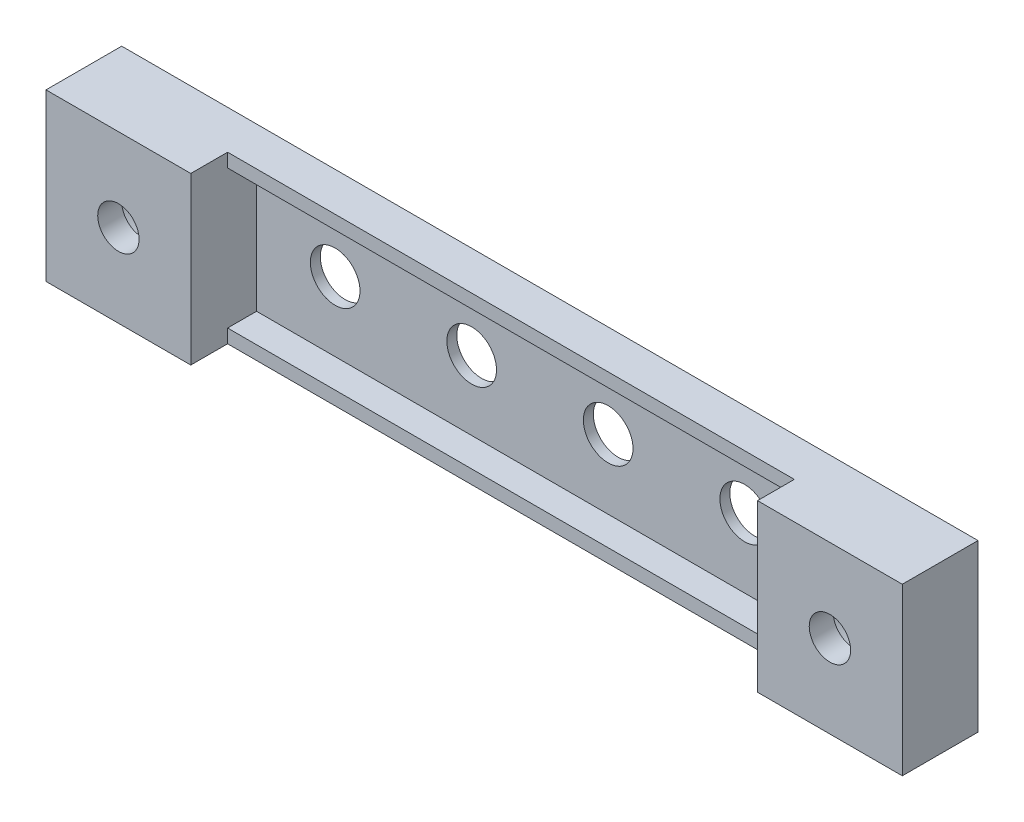
ISO-10303-21;
HEADER;
FILE_DESCRIPTION(('STEP AP214'),'2;1');
FILE_NAME('part.step','',(''),(''),'','','');
FILE_SCHEMA(('AUTOMOTIVE_DESIGN { 1 0 10303 214 1 1 1 1 }'));
ENDSEC;
DATA;
#1=APPLICATION_CONTEXT('core data for automotive mechanical design processes');
#2=APPLICATION_PROTOCOL_DEFINITION('international standard','automotive_design',2000,#1);
#3=PRODUCT_CONTEXT('',#1,'mechanical');
#4=PRODUCT('Part','Part','',(#3));
#5=PRODUCT_RELATED_PRODUCT_CATEGORY('part','',(#4));
#6=PRODUCT_DEFINITION_FORMATION('','',#4);
#7=PRODUCT_DEFINITION_CONTEXT('part definition',#1,'design');
#8=PRODUCT_DEFINITION('design','',#6,#7);
#9=PRODUCT_DEFINITION_SHAPE('','',#8);
#10=(LENGTH_UNIT() NAMED_UNIT(*) SI_UNIT(.MILLI.,.METRE.));
#11=(NAMED_UNIT(*) PLANE_ANGLE_UNIT() SI_UNIT($,.RADIAN.));
#12=(NAMED_UNIT(*) SI_UNIT($,.STERADIAN.) SOLID_ANGLE_UNIT());
#13=UNCERTAINTY_MEASURE_WITH_UNIT(LENGTH_MEASURE(1.E-05),#10,'distance_accuracy_value','');
#14=(GEOMETRIC_REPRESENTATION_CONTEXT(3) GLOBAL_UNCERTAINTY_ASSIGNED_CONTEXT((#13)) GLOBAL_UNIT_ASSIGNED_CONTEXT((#10,
#11,#12)) REPRESENTATION_CONTEXT('',''));
#15=CARTESIAN_POINT('',(0.,0.,0.));
#16=DIRECTION('',(0.,0.,1.));
#17=DIRECTION('',(1.,0.,0.));
#18=AXIS2_PLACEMENT_3D('',#15,#16,#17);
#19=CARTESIAN_POINT('',(-16.7,7.69215932263775,1.4));
#20=DIRECTION('',(0.,-1.,0.));
#21=DIRECTION('',(0.,0.,-1.));
#22=AXIS2_PLACEMENT_3D('',#19,#20,#21);
#23=PLANE('',#22);
#24=DIRECTION('',(1.,0.,0.));
#25=VECTOR('',#24,1.);
#26=CARTESIAN_POINT('',(-16.7,7.69215932263775,-0.48));
#27=LINE('',#26,#25);
#28=CARTESIAN_POINT('',(-20.7,7.69215932263775,-0.48));
#29=VERTEX_POINT('',#28);
#30=CARTESIAN_POINT('',(20.7,7.69215932263775,-0.48));
#31=VERTEX_POINT('',#30);
#32=EDGE_CURVE('E127',#29,#31,#27,.T.);
#33=ORIENTED_EDGE('',*,*,#32,.F.);
#34=DIRECTION('',(0.,0.,-1.));
#35=VECTOR('',#34,1.);
#36=CARTESIAN_POINT('',(-20.7,7.69215932263775,-0.48));
#37=LINE('',#36,#35);
#38=CARTESIAN_POINT('',(-20.7,7.69215932263775,3.18));
#39=VERTEX_POINT('',#38);
#40=EDGE_CURVE('E139',#39,#29,#37,.T.);
#41=ORIENTED_EDGE('',*,*,#40,.F.);
#42=DIRECTION('',(-1.,0.,0.));
#43=VECTOR('',#42,1.);
#44=CARTESIAN_POINT('',(-16.7,7.69215932263775,3.18));
#45=LINE('',#44,#43);
#46=CARTESIAN_POINT('',(-13.7,7.69215932263775,3.18));
#47=VERTEX_POINT('',#46);
#48=EDGE_CURVE('E221',#47,#39,#45,.T.);
#49=ORIENTED_EDGE('',*,*,#48,.F.);
#50=DIRECTION('',(0.,0.,-1.));
#51=VECTOR('',#50,1.);
#52=CARTESIAN_POINT('',(-13.7,7.69215932263775,3.18));
#53=LINE('',#52,#51);
#54=CARTESIAN_POINT('',(-13.7,7.69215932263775,1.4));
#55=VERTEX_POINT('',#54);
#56=EDGE_CURVE('E222',#47,#55,#53,.T.);
#57=ORIENTED_EDGE('',*,*,#56,.T.);
#58=DIRECTION('',(-1.,0.,0.));
#59=VECTOR('',#58,1.);
#60=CARTESIAN_POINT('',(-16.7,7.69215932263775,1.4));
#61=LINE('',#60,#59);
#62=CARTESIAN_POINT('',(13.7,7.69215932263775,1.4));
#63=VERTEX_POINT('',#62);
#64=EDGE_CURVE('E256',#63,#55,#61,.T.);
#65=ORIENTED_EDGE('',*,*,#64,.F.);
#66=DIRECTION('',(0.,0.,-1.));
#67=VECTOR('',#66,1.);
#68=CARTESIAN_POINT('',(13.7,7.69215932263775,3.18));
#69=LINE('',#68,#67);
#70=CARTESIAN_POINT('',(13.7,7.69215932263775,3.18));
#71=VERTEX_POINT('',#70);
#72=EDGE_CURVE('E215',#71,#63,#69,.T.);
#73=ORIENTED_EDGE('',*,*,#72,.F.);
#74=DIRECTION('',(-1.,0.,0.));
#75=VECTOR('',#74,1.);
#76=CARTESIAN_POINT('',(16.7,7.69215932263775,3.18));
#77=LINE('',#76,#75);
#78=CARTESIAN_POINT('',(20.7,7.69215932263775,3.18));
#79=VERTEX_POINT('',#78);
#80=EDGE_CURVE('E144',#79,#71,#77,.T.);
#81=ORIENTED_EDGE('',*,*,#80,.F.);
#82=DIRECTION('',(0.,0.,1.));
#83=VECTOR('',#82,1.);
#84=CARTESIAN_POINT('',(20.7,7.69215932263775,-0.48));
#85=LINE('',#84,#83);
#86=EDGE_CURVE('E142',#31,#79,#85,.T.);
#87=ORIENTED_EDGE('',*,*,#86,.F.);
#88=EDGE_LOOP('',(#33,#41,#49,#57,#65,#73,#81,#87));
#89=FACE_BOUND('',#88,.T.);
#90=ADVANCED_FACE('F35',(#89),#23,.F.);
#91=CARTESIAN_POINT('',(-16.7,-0.330719774212582,1.4));
#92=DIRECTION('',(0.,1.,0.));
#93=DIRECTION('',(0.,0.,1.));
#94=AXIS2_PLACEMENT_3D('',#91,#92,#93);
#95=PLANE('',#94);
#96=DIRECTION('',(-1.,0.,0.));
#97=VECTOR('',#96,1.);
#98=CARTESIAN_POINT('',(-16.7,-0.330719774212582,-0.48));
#99=LINE('',#98,#97);
#100=CARTESIAN_POINT('',(20.7,-0.330719774212582,-0.48));
#101=VERTEX_POINT('',#100);
#102=CARTESIAN_POINT('',(-20.7,-0.330719774212582,-0.48));
#103=VERTEX_POINT('',#102);
#104=EDGE_CURVE('E138',#101,#103,#99,.T.);
#105=ORIENTED_EDGE('',*,*,#104,.F.);
#106=DIRECTION('',(0.,0.,-1.));
#107=VECTOR('',#106,1.);
#108=CARTESIAN_POINT('',(20.7,-0.330719774212582,-0.48));
#109=LINE('',#108,#107);
#110=CARTESIAN_POINT('',(20.7,-0.330719774212582,3.18));
#111=VERTEX_POINT('',#110);
#112=EDGE_CURVE('E153',#111,#101,#109,.T.);
#113=ORIENTED_EDGE('',*,*,#112,.F.);
#114=DIRECTION('',(1.,0.,0.));
#115=VECTOR('',#114,1.);
#116=CARTESIAN_POINT('',(16.7,-0.330719774212582,3.18));
#117=LINE('',#116,#115);
#118=CARTESIAN_POINT('',(13.7,-0.330719774212582,3.18));
#119=VERTEX_POINT('',#118);
#120=EDGE_CURVE('E209',#119,#111,#117,.T.);
#121=ORIENTED_EDGE('',*,*,#120,.F.);
#122=DIRECTION('',(0.,0.,-1.));
#123=VECTOR('',#122,1.);
#124=CARTESIAN_POINT('',(13.7,-0.330719774212582,3.18));
#125=LINE('',#124,#123);
#126=CARTESIAN_POINT('',(13.7,-0.330719774212582,1.4));
#127=VERTEX_POINT('',#126);
#128=EDGE_CURVE('E211',#119,#127,#125,.T.);
#129=ORIENTED_EDGE('',*,*,#128,.T.);
#130=DIRECTION('',(1.,0.,0.));
#131=VECTOR('',#130,1.);
#132=CARTESIAN_POINT('',(-16.7,-0.330719774212582,1.4));
#133=LINE('',#132,#131);
#134=CARTESIAN_POINT('',(-13.7,-0.330719774212582,1.4));
#135=VERTEX_POINT('',#134);
#136=EDGE_CURVE('E43',#135,#127,#133,.T.);
#137=ORIENTED_EDGE('',*,*,#136,.F.);
#138=DIRECTION('',(0.,0.,-1.));
#139=VECTOR('',#138,1.);
#140=CARTESIAN_POINT('',(-13.7,-0.330719774212582,3.18));
#141=LINE('',#140,#139);
#142=CARTESIAN_POINT('',(-13.7,-0.330719774212582,3.18));
#143=VERTEX_POINT('',#142);
#144=EDGE_CURVE('E226',#143,#135,#141,.T.);
#145=ORIENTED_EDGE('',*,*,#144,.F.);
#146=DIRECTION('',(1.,0.,0.));
#147=VECTOR('',#146,1.);
#148=CARTESIAN_POINT('',(-16.7,-0.330719774212582,3.18));
#149=LINE('',#148,#147);
#150=CARTESIAN_POINT('',(-20.7,-0.330719774212582,3.18));
#151=VERTEX_POINT('',#150);
#152=EDGE_CURVE('E217',#151,#143,#149,.T.);
#153=ORIENTED_EDGE('',*,*,#152,.F.);
#154=DIRECTION('',(0.,0.,1.));
#155=VECTOR('',#154,1.);
#156=CARTESIAN_POINT('',(-20.7,-0.330719774212582,-0.48));
#157=LINE('',#156,#155);
#158=EDGE_CURVE('E176',#103,#151,#157,.T.);
#159=ORIENTED_EDGE('',*,*,#158,.F.);
#160=EDGE_LOOP('',(#105,#113,#121,#129,#137,#145,#153,#159));
#161=FACE_BOUND('',#160,.T.);
#162=ADVANCED_FACE('F260',(#161),#95,.F.);
#163=CARTESIAN_POINT('',(9.9,3.68071977421258,0.42));
#164=DIRECTION('',(0.,0.,-1.));
#165=DIRECTION('',(-1.,0.,0.));
#166=AXIS2_PLACEMENT_3D('',#163,#164,#165);
#167=CYLINDRICAL_SURFACE('',#166,1.2);
#168=CARTESIAN_POINT('',(9.9,3.68071977421258,0.));
#169=DIRECTION('',(0.,0.,1.));
#170=DIRECTION('',(1.,0.,0.));
#171=AXIS2_PLACEMENT_3D('',#168,#169,#170);
#172=CIRCLE('',#171,1.2);
#173=CARTESIAN_POINT('',(11.1,3.68071977421258,0.));
#174=VERTEX_POINT('',#173);
#175=EDGE_CURVE('E202',#174,#174,#172,.T.);
#176=ORIENTED_EDGE('',*,*,#175,.T.);
#177=EDGE_LOOP('',(#176));
#178=FACE_BOUND('',#177,.T.);
#179=CARTESIAN_POINT('',(9.9,3.68071977421258,-0.48));
#180=DIRECTION('',(0.,0.,-1.));
#181=DIRECTION('',(-1.,0.,0.));
#182=AXIS2_PLACEMENT_3D('',#179,#180,#181);
#183=CIRCLE('',#182,1.2);
#184=CARTESIAN_POINT('',(8.7,3.68071977421258,-0.48));
#185=VERTEX_POINT('',#184);
#186=EDGE_CURVE('E190',#185,#185,#183,.F.);
#187=ORIENTED_EDGE('',*,*,#186,.F.);
#188=EDGE_LOOP('',(#187));
#189=FACE_BOUND('',#188,.T.);
#190=ADVANCED_FACE('F303',(#178,#189),#167,.F.);
#191=CARTESIAN_POINT('',(-9.9,3.68071977421258,0.42));
#192=DIRECTION('',(0.,0.,-1.));
#193=DIRECTION('',(-1.,0.,0.));
#194=AXIS2_PLACEMENT_3D('',#191,#192,#193);
#195=CYLINDRICAL_SURFACE('',#194,1.2);
#196=CARTESIAN_POINT('',(-9.9,3.68071977421258,0.));
#197=DIRECTION('',(0.,0.,1.));
#198=DIRECTION('',(1.,0.,0.));
#199=AXIS2_PLACEMENT_3D('',#196,#197,#198);
#200=CIRCLE('',#199,1.2);
#201=CARTESIAN_POINT('',(-8.7,3.68071977421258,0.));
#202=VERTEX_POINT('',#201);
#203=EDGE_CURVE('E193',#202,#202,#200,.T.);
#204=ORIENTED_EDGE('',*,*,#203,.T.);
#205=EDGE_LOOP('',(#204));
#206=FACE_BOUND('',#205,.T.);
#207=CARTESIAN_POINT('',(-9.9,3.68071977421258,-0.48));
#208=DIRECTION('',(0.,0.,-1.));
#209=DIRECTION('',(-1.,0.,0.));
#210=AXIS2_PLACEMENT_3D('',#207,#208,#209);
#211=CIRCLE('',#210,1.2);
#212=CARTESIAN_POINT('',(-11.1,3.68071977421258,-0.48));
#213=VERTEX_POINT('',#212);
#214=EDGE_CURVE('E187',#213,#213,#211,.F.);
#215=ORIENTED_EDGE('',*,*,#214,.F.);
#216=EDGE_LOOP('',(#215));
#217=FACE_BOUND('',#216,.T.);
#218=ADVANCED_FACE('F307',(#206,#217),#195,.F.);
#219=CARTESIAN_POINT('',(-3.3,3.68071977421258,0.42));
#220=DIRECTION('',(0.,0.,-1.));
#221=DIRECTION('',(-1.,0.,0.));
#222=AXIS2_PLACEMENT_3D('',#219,#220,#221);
#223=CYLINDRICAL_SURFACE('',#222,1.2);
#224=CARTESIAN_POINT('',(-3.3,3.68071977421258,0.));
#225=DIRECTION('',(0.,0.,1.));
#226=DIRECTION('',(1.,0.,0.));
#227=AXIS2_PLACEMENT_3D('',#224,#225,#226);
#228=CIRCLE('',#227,1.2);
#229=CARTESIAN_POINT('',(-2.1,3.68071977421258,0.));
#230=VERTEX_POINT('',#229);
#231=EDGE_CURVE('E196',#230,#230,#228,.T.);
#232=ORIENTED_EDGE('',*,*,#231,.T.);
#233=EDGE_LOOP('',(#232));
#234=FACE_BOUND('',#233,.T.);
#235=CARTESIAN_POINT('',(-3.3,3.68071977421258,-0.48));
#236=DIRECTION('',(0.,0.,-1.));
#237=DIRECTION('',(-1.,0.,0.));
#238=AXIS2_PLACEMENT_3D('',#235,#236,#237);
#239=CIRCLE('',#238,1.2);
#240=CARTESIAN_POINT('',(-4.5,3.68071977421258,-0.48));
#241=VERTEX_POINT('',#240);
#242=EDGE_CURVE('E184',#241,#241,#239,.F.);
#243=ORIENTED_EDGE('',*,*,#242,.F.);
#244=EDGE_LOOP('',(#243));
#245=FACE_BOUND('',#244,.T.);
#246=ADVANCED_FACE('F317',(#234,#245),#223,.F.);
#247=CARTESIAN_POINT('',(3.3,3.68071977421258,0.42));
#248=DIRECTION('',(0.,0.,-1.));
#249=DIRECTION('',(-1.,0.,0.));
#250=AXIS2_PLACEMENT_3D('',#247,#248,#249);
#251=CYLINDRICAL_SURFACE('',#250,1.2);
#252=CARTESIAN_POINT('',(3.3,3.68071977421258,0.));
#253=DIRECTION('',(0.,0.,1.));
#254=DIRECTION('',(1.,0.,0.));
#255=AXIS2_PLACEMENT_3D('',#252,#253,#254);
#256=CIRCLE('',#255,1.2);
#257=CARTESIAN_POINT('',(4.5,3.68071977421258,0.));
#258=VERTEX_POINT('',#257);
#259=EDGE_CURVE('E199',#258,#258,#256,.T.);
#260=ORIENTED_EDGE('',*,*,#259,.T.);
#261=EDGE_LOOP('',(#260));
#262=FACE_BOUND('',#261,.T.);
#263=CARTESIAN_POINT('',(3.3,3.68071977421258,-0.48));
#264=DIRECTION('',(0.,0.,-1.));
#265=DIRECTION('',(-1.,0.,0.));
#266=AXIS2_PLACEMENT_3D('',#263,#264,#265);
#267=CIRCLE('',#266,1.2);
#268=CARTESIAN_POINT('',(2.1,3.68071977421258,-0.48));
#269=VERTEX_POINT('',#268);
#270=EDGE_CURVE('E38',#269,#269,#267,.F.);
#271=ORIENTED_EDGE('',*,*,#270,.F.);
#272=EDGE_LOOP('',(#271));
#273=FACE_BOUND('',#272,.T.);
#274=ADVANCED_FACE('F312',(#262,#273),#251,.F.);
#275=CARTESIAN_POINT('',(0.,0.,1.4));
#276=DIRECTION('',(0.,0.,1.));
#277=DIRECTION('',(1.,0.,0.));
#278=AXIS2_PLACEMENT_3D('',#275,#276,#277);
#279=PLANE('',#278);
#280=ORIENTED_EDGE('',*,*,#136,.T.);
#281=DIRECTION('',(0.,-1.,0.));
#282=VECTOR('',#281,1.);
#283=CARTESIAN_POINT('',(13.7,7.69215932263775,1.4));
#284=LINE('',#283,#282);
#285=CARTESIAN_POINT('',(13.7,0.330719774212581,1.4));
#286=VERTEX_POINT('',#285);
#287=EDGE_CURVE('E205',#286,#127,#284,.T.);
#288=ORIENTED_EDGE('',*,*,#287,.F.);
#289=DIRECTION('',(1.,0.,0.));
#290=VECTOR('',#289,1.);
#291=CARTESIAN_POINT('',(-13.7,0.330719774212582,1.4));
#292=LINE('',#291,#290);
#293=CARTESIAN_POINT('',(-13.7,0.330719774212582,1.4));
#294=VERTEX_POINT('',#293);
#295=EDGE_CURVE('E230',#294,#286,#292,.T.);
#296=ORIENTED_EDGE('',*,*,#295,.F.);
#297=DIRECTION('',(0.,1.,0.));
#298=VECTOR('',#297,1.);
#299=CARTESIAN_POINT('',(-13.7,7.69215932263775,1.4));
#300=LINE('',#299,#298);
#301=EDGE_CURVE('E45',#135,#294,#300,.T.);
#302=ORIENTED_EDGE('',*,*,#301,.F.);
#303=EDGE_LOOP('',(#280,#288,#296,#302));
#304=FACE_BOUND('',#303,.T.);
#305=ADVANCED_FACE('F257',(#304),#279,.T.);
#306=DIRECTION('',(-1.,0.,0.));
#307=VECTOR('',#306,1.);
#308=CARTESIAN_POINT('',(-13.7,7.03071977421258,1.4));
#309=LINE('',#308,#307);
#310=CARTESIAN_POINT('',(13.7,7.03071977421258,1.4));
#311=VERTEX_POINT('',#310);
#312=CARTESIAN_POINT('',(-13.7,7.03071977421258,1.4));
#313=VERTEX_POINT('',#312);
#314=EDGE_CURVE('E233',#311,#313,#309,.T.);
#315=ORIENTED_EDGE('',*,*,#314,.F.);
#316=EDGE_CURVE('E59',#63,#311,#284,.T.);
#317=ORIENTED_EDGE('',*,*,#316,.F.);
#318=ORIENTED_EDGE('',*,*,#64,.T.);
#319=EDGE_CURVE('E11',#313,#55,#300,.T.);
#320=ORIENTED_EDGE('',*,*,#319,.F.);
#321=EDGE_LOOP('',(#315,#317,#318,#320));
#322=FACE_BOUND('',#321,.T.);
#323=ADVANCED_FACE('F279',(#322),#279,.T.);
#324=CARTESIAN_POINT('',(-13.7,7.03071977421258,1.4));
#325=DIRECTION('',(1.,0.,0.));
#326=DIRECTION('',(0.,1.,0.));
#327=AXIS2_PLACEMENT_3D('',#324,#325,#326);
#328=PLANE('',#327);
#329=DIRECTION('',(0.,-1.,0.));
#330=VECTOR('',#329,1.);
#331=CARTESIAN_POINT('',(-13.7,7.03071977421258,0.));
#332=LINE('',#331,#330);
#333=CARTESIAN_POINT('',(-13.7,7.03071977421258,0.));
#334=VERTEX_POINT('',#333);
#335=CARTESIAN_POINT('',(-13.7,0.330719774212582,0.));
#336=VERTEX_POINT('',#335);
#337=EDGE_CURVE('E229',#334,#336,#332,.T.);
#338=ORIENTED_EDGE('',*,*,#337,.F.);
#339=DIRECTION('',(0.,0.,-1.));
#340=VECTOR('',#339,1.);
#341=CARTESIAN_POINT('',(-13.7,7.03071977421258,1.4));
#342=LINE('',#341,#340);
#343=EDGE_CURVE('E237',#313,#334,#342,.T.);
#344=ORIENTED_EDGE('',*,*,#343,.F.);
#345=ORIENTED_EDGE('',*,*,#319,.T.);
#346=ORIENTED_EDGE('',*,*,#56,.F.);
#347=DIRECTION('',(0.,1.,0.));
#348=VECTOR('',#347,1.);
#349=CARTESIAN_POINT('',(-13.7,7.69215932263775,3.18));
#350=LINE('',#349,#348);
#351=EDGE_CURVE('E219',#143,#47,#350,.T.);
#352=ORIENTED_EDGE('',*,*,#351,.F.);
#353=ORIENTED_EDGE('',*,*,#144,.T.);
#354=ORIENTED_EDGE('',*,*,#301,.T.);
#355=DIRECTION('',(0.,0.,-1.));
#356=VECTOR('',#355,1.);
#357=CARTESIAN_POINT('',(-13.7,0.330719774212582,1.4));
#358=LINE('',#357,#356);
#359=EDGE_CURVE('E253',#294,#336,#358,.T.);
#360=ORIENTED_EDGE('',*,*,#359,.T.);
#361=EDGE_LOOP('',(#338,#344,#345,#346,#352,#353,#354,#360));
#362=FACE_BOUND('',#361,.T.);
#363=ADVANCED_FACE('F266',(#362),#328,.T.);
#364=CARTESIAN_POINT('',(-13.7,0.330719774212582,1.4));
#365=DIRECTION('',(0.,1.,0.));
#366=DIRECTION('',(0.,0.,1.));
#367=AXIS2_PLACEMENT_3D('',#364,#365,#366);
#368=PLANE('',#367);
#369=DIRECTION('',(1.,0.,0.));
#370=VECTOR('',#369,1.);
#371=CARTESIAN_POINT('',(-13.7,0.330719774212582,0.));
#372=LINE('',#371,#370);
#373=CARTESIAN_POINT('',(13.7,0.330719774212582,0.));
#374=VERTEX_POINT('',#373);
#375=EDGE_CURVE('E240',#336,#374,#372,.T.);
#376=ORIENTED_EDGE('',*,*,#375,.F.);
#377=ORIENTED_EDGE('',*,*,#359,.F.);
#378=ORIENTED_EDGE('',*,*,#295,.T.);
#379=DIRECTION('',(0.,0.,-1.));
#380=VECTOR('',#379,1.);
#381=CARTESIAN_POINT('',(13.7,0.330719774212582,1.4));
#382=LINE('',#381,#380);
#383=EDGE_CURVE('E251',#286,#374,#382,.T.);
#384=ORIENTED_EDGE('',*,*,#383,.T.);
#385=EDGE_LOOP('',(#376,#377,#378,#384));
#386=FACE_BOUND('',#385,.T.);
#387=ADVANCED_FACE('F290',(#386),#368,.T.);
#388=CARTESIAN_POINT('',(13.7,7.03071977421258,1.4));
#389=DIRECTION('',(-1.,0.,0.));
#390=DIRECTION('',(0.,-1.,0.));
#391=AXIS2_PLACEMENT_3D('',#388,#389,#390);
#392=PLANE('',#391);
#393=DIRECTION('',(0.,1.,0.));
#394=VECTOR('',#393,1.);
#395=CARTESIAN_POINT('',(13.7,7.03071977421258,0.));
#396=LINE('',#395,#394);
#397=CARTESIAN_POINT('',(13.7,7.03071977421258,0.));
#398=VERTEX_POINT('',#397);
#399=EDGE_CURVE('E243',#374,#398,#396,.T.);
#400=ORIENTED_EDGE('',*,*,#399,.F.);
#401=ORIENTED_EDGE('',*,*,#383,.F.);
#402=ORIENTED_EDGE('',*,*,#287,.T.);
#403=ORIENTED_EDGE('',*,*,#128,.F.);
#404=DIRECTION('',(0.,-1.,0.));
#405=VECTOR('',#404,1.);
#406=CARTESIAN_POINT('',(13.7,7.69215932263775,3.18));
#407=LINE('',#406,#405);
#408=EDGE_CURVE('E207',#71,#119,#407,.T.);
#409=ORIENTED_EDGE('',*,*,#408,.F.);
#410=ORIENTED_EDGE('',*,*,#72,.T.);
#411=ORIENTED_EDGE('',*,*,#316,.T.);
#412=DIRECTION('',(0.,0.,-1.));
#413=VECTOR('',#412,1.);
#414=CARTESIAN_POINT('',(13.7,7.03071977421258,1.4));
#415=LINE('',#414,#413);
#416=EDGE_CURVE('E249',#311,#398,#415,.T.);
#417=ORIENTED_EDGE('',*,*,#416,.T.);
#418=EDGE_LOOP('',(#400,#401,#402,#403,#409,#410,#411,#417));
#419=FACE_BOUND('',#418,.T.);
#420=ADVANCED_FACE('F285',(#419),#392,.T.);
#421=CARTESIAN_POINT('',(-13.7,7.03071977421258,1.4));
#422=DIRECTION('',(0.,-1.,0.));
#423=DIRECTION('',(0.,0.,-1.));
#424=AXIS2_PLACEMENT_3D('',#421,#422,#423);
#425=PLANE('',#424);
#426=DIRECTION('',(-1.,0.,0.));
#427=VECTOR('',#426,1.);
#428=CARTESIAN_POINT('',(-13.7,7.03071977421258,0.));
#429=LINE('',#428,#427);
#430=EDGE_CURVE('E234',#398,#334,#429,.T.);
#431=ORIENTED_EDGE('',*,*,#430,.F.);
#432=ORIENTED_EDGE('',*,*,#416,.F.);
#433=ORIENTED_EDGE('',*,*,#314,.T.);
#434=ORIENTED_EDGE('',*,*,#343,.T.);
#435=EDGE_LOOP('',(#431,#432,#433,#434));
#436=FACE_BOUND('',#435,.T.);
#437=ADVANCED_FACE('F283',(#436),#425,.T.);
#438=CARTESIAN_POINT('',(0.,0.,3.18));
#439=DIRECTION('',(0.,0.,1.));
#440=DIRECTION('',(1.,0.,0.));
#441=AXIS2_PLACEMENT_3D('',#438,#439,#440);
#442=PLANE('',#441);
#443=CARTESIAN_POINT('',(-17.2,3.68071977421258,3.18));
#444=DIRECTION('',(0.,0.,1.));
#445=DIRECTION('',(1.,0.,0.));
#446=AXIS2_PLACEMENT_3D('',#443,#444,#445);
#447=CIRCLE('',#446,1.);
#448=CARTESIAN_POINT('',(-16.2,3.68071977421258,3.18));
#449=VERTEX_POINT('',#448);
#450=EDGE_CURVE('E166',#449,#449,#447,.T.);
#451=ORIENTED_EDGE('',*,*,#450,.F.);
#452=EDGE_LOOP('',(#451));
#453=FACE_BOUND('',#452,.T.);
#454=ORIENTED_EDGE('',*,*,#48,.T.);
#455=DIRECTION('',(0.,1.,0.));
#456=VECTOR('',#455,1.);
#457=CARTESIAN_POINT('',(-20.7,-0.330719774212582,3.18));
#458=LINE('',#457,#456);
#459=EDGE_CURVE('E179',#151,#39,#458,.T.);
#460=ORIENTED_EDGE('',*,*,#459,.F.);
#461=ORIENTED_EDGE('',*,*,#152,.T.);
#462=ORIENTED_EDGE('',*,*,#351,.T.);
#463=EDGE_LOOP('',(#454,#460,#461,#462));
#464=FACE_BOUND('',#463,.T.);
#465=ADVANCED_FACE('F270',(#453,#464),#442,.T.);
#466=CARTESIAN_POINT('',(0.,0.,3.18));
#467=DIRECTION('',(0.,0.,-1.));
#468=DIRECTION('',(-1.,0.,0.));
#469=AXIS2_PLACEMENT_3D('',#466,#467,#468);
#470=PLANE('',#469);
#471=CARTESIAN_POINT('',(17.2,3.68071977421258,3.18));
#472=DIRECTION('',(0.,0.,-1.));
#473=DIRECTION('',(-1.,0.,0.));
#474=AXIS2_PLACEMENT_3D('',#471,#472,#473);
#475=CIRCLE('',#474,1.);
#476=CARTESIAN_POINT('',(16.2,3.68071977421258,3.18));
#477=VERTEX_POINT('',#476);
#478=EDGE_CURVE('E566',#477,#477,#475,.T.);
#479=ORIENTED_EDGE('',*,*,#478,.T.);
#480=EDGE_LOOP('',(#479));
#481=FACE_BOUND('',#480,.T.);
#482=ORIENTED_EDGE('',*,*,#120,.T.);
#483=DIRECTION('',(0.,-1.,0.));
#484=VECTOR('',#483,1.);
#485=CARTESIAN_POINT('',(20.7,-0.330719774212582,3.18));
#486=LINE('',#485,#484);
#487=EDGE_CURVE('E148',#79,#111,#486,.T.);
#488=ORIENTED_EDGE('',*,*,#487,.F.);
#489=ORIENTED_EDGE('',*,*,#80,.T.);
#490=ORIENTED_EDGE('',*,*,#408,.T.);
#491=EDGE_LOOP('',(#482,#488,#489,#490));
#492=FACE_BOUND('',#491,.T.);
#493=ADVANCED_FACE('F334',(#481,#492),#470,.F.);
#494=CARTESIAN_POINT('',(0.,0.,0.));
#495=DIRECTION('',(0.,0.,1.));
#496=DIRECTION('',(1.,0.,0.));
#497=AXIS2_PLACEMENT_3D('',#494,#495,#496);
#498=PLANE('',#497);
#499=ORIENTED_EDGE('',*,*,#259,.F.);
#500=EDGE_LOOP('',(#499));
#501=FACE_BOUND('',#500,.T.);
#502=ORIENTED_EDGE('',*,*,#231,.F.);
#503=EDGE_LOOP('',(#502));
#504=FACE_BOUND('',#503,.T.);
#505=ORIENTED_EDGE('',*,*,#203,.F.);
#506=EDGE_LOOP('',(#505));
#507=FACE_BOUND('',#506,.T.);
#508=ORIENTED_EDGE('',*,*,#175,.F.);
#509=EDGE_LOOP('',(#508));
#510=FACE_BOUND('',#509,.T.);
#511=ORIENTED_EDGE('',*,*,#430,.T.);
#512=ORIENTED_EDGE('',*,*,#337,.T.);
#513=ORIENTED_EDGE('',*,*,#375,.T.);
#514=ORIENTED_EDGE('',*,*,#399,.T.);
#515=EDGE_LOOP('',(#511,#512,#513,#514));
#516=FACE_BOUND('',#515,.T.);
#517=ADVANCED_FACE('F288',(#501,#504,#507,#510,#516),#498,.T.);
#518=CARTESIAN_POINT('',(0.,0.,-0.48));
#519=DIRECTION('',(0.,0.,-1.));
#520=DIRECTION('',(-1.,0.,0.));
#521=AXIS2_PLACEMENT_3D('',#518,#519,#520);
#522=PLANE('',#521);
#523=CARTESIAN_POINT('',(17.2,3.68071977421258,-0.48));
#524=DIRECTION('',(0.,0.,-1.));
#525=DIRECTION('',(-1.,0.,0.));
#526=AXIS2_PLACEMENT_3D('',#523,#524,#525);
#527=CIRCLE('',#526,2.5);
#528=CARTESIAN_POINT('',(14.7,3.68071977421258,-0.48));
#529=VERTEX_POINT('',#528);
#530=EDGE_CURVE('E157',#529,#529,#527,.T.);
#531=ORIENTED_EDGE('',*,*,#530,.F.);
#532=EDGE_LOOP('',(#531));
#533=FACE_BOUND('',#532,.T.);
#534=CARTESIAN_POINT('',(-17.2,3.68071977421258,-0.48));
#535=DIRECTION('',(0.,0.,-1.));
#536=DIRECTION('',(-1.,0.,0.));
#537=AXIS2_PLACEMENT_3D('',#534,#535,#536);
#538=CIRCLE('',#537,2.5);
#539=CARTESIAN_POINT('',(-19.7,3.68071977421258,-0.48));
#540=VERTEX_POINT('',#539);
#541=EDGE_CURVE('E169',#540,#540,#538,.T.);
#542=ORIENTED_EDGE('',*,*,#541,.F.);
#543=EDGE_LOOP('',(#542));
#544=FACE_BOUND('',#543,.T.);
#545=ORIENTED_EDGE('',*,*,#104,.T.);
#546=DIRECTION('',(0.,-1.,0.));
#547=VECTOR('',#546,1.);
#548=CARTESIAN_POINT('',(-20.7,-0.330719774212582,-0.48));
#549=LINE('',#548,#547);
#550=EDGE_CURVE('E134',#29,#103,#549,.T.);
#551=ORIENTED_EDGE('',*,*,#550,.F.);
#552=ORIENTED_EDGE('',*,*,#32,.T.);
#553=DIRECTION('',(0.,1.,0.));
#554=VECTOR('',#553,1.);
#555=CARTESIAN_POINT('',(20.7,-0.330719774212582,-0.48));
#556=LINE('',#555,#554);
#557=EDGE_CURVE('E132',#101,#31,#556,.T.);
#558=ORIENTED_EDGE('',*,*,#557,.F.);
#559=EDGE_LOOP('',(#545,#551,#552,#558));
#560=FACE_BOUND('',#559,.T.);
#561=ORIENTED_EDGE('',*,*,#270,.T.);
#562=EDGE_LOOP('',(#561));
#563=FACE_BOUND('',#562,.T.);
#564=ORIENTED_EDGE('',*,*,#242,.T.);
#565=EDGE_LOOP('',(#564));
#566=FACE_BOUND('',#565,.T.);
#567=ORIENTED_EDGE('',*,*,#214,.T.);
#568=EDGE_LOOP('',(#567));
#569=FACE_BOUND('',#568,.T.);
#570=ORIENTED_EDGE('',*,*,#186,.T.);
#571=EDGE_LOOP('',(#570));
#572=FACE_BOUND('',#571,.T.);
#573=ADVANCED_FACE('F129',(#533,#544,#560,#563,#566,#569,#572),#522,.T.);
#574=CARTESIAN_POINT('',(-20.7,0.,0.));
#575=DIRECTION('',(1.,0.,0.));
#576=DIRECTION('',(0.,0.,-1.));
#577=AXIS2_PLACEMENT_3D('',#574,#575,#576);
#578=PLANE('',#577);
#579=ORIENTED_EDGE('',*,*,#550,.T.);
#580=ORIENTED_EDGE('',*,*,#158,.T.);
#581=ORIENTED_EDGE('',*,*,#459,.T.);
#582=ORIENTED_EDGE('',*,*,#40,.T.);
#583=EDGE_LOOP('',(#579,#580,#581,#582));
#584=FACE_BOUND('',#583,.T.);
#585=ADVANCED_FACE('F274',(#584),#578,.F.);
#586=CARTESIAN_POINT('',(-17.2,3.68071977421258,2.02));
#587=DIRECTION('',(0.,0.,-1.));
#588=DIRECTION('',(-1.,0.,0.));
#589=AXIS2_PLACEMENT_3D('',#586,#587,#588);
#590=CYLINDRICAL_SURFACE('',#589,2.5);
#591=CARTESIAN_POINT('',(-17.2,3.68071977421258,2.02));
#592=DIRECTION('',(0.,0.,-1.));
#593=DIRECTION('',(-1.,0.,0.));
#594=AXIS2_PLACEMENT_3D('',#591,#592,#593);
#595=CIRCLE('',#594,2.5);
#596=CARTESIAN_POINT('',(-19.7,3.68071977421258,2.02));
#597=VERTEX_POINT('',#596);
#598=EDGE_CURVE('E170',#597,#597,#595,.T.);
#599=ORIENTED_EDGE('',*,*,#598,.F.);
#600=EDGE_LOOP('',(#599));
#601=FACE_BOUND('',#600,.T.);
#602=ORIENTED_EDGE('',*,*,#541,.T.);
#603=EDGE_LOOP('',(#602));
#604=FACE_BOUND('',#603,.T.);
#605=ADVANCED_FACE('F377',(#601,#604),#590,.F.);
#606=CARTESIAN_POINT('',(-17.2,3.68071977421258,2.02));
#607=DIRECTION('',(0.,0.,-1.));
#608=DIRECTION('',(-1.,0.,0.));
#609=AXIS2_PLACEMENT_3D('',#606,#607,#608);
#610=PLANE('',#609);
#611=CARTESIAN_POINT('',(-17.2,3.68071977421258,2.02));
#612=DIRECTION('',(0.,0.,-1.));
#613=DIRECTION('',(-1.,0.,0.));
#614=AXIS2_PLACEMENT_3D('',#611,#612,#613);
#615=CIRCLE('',#614,1.);
#616=CARTESIAN_POINT('',(-18.2,3.68071977421258,2.02));
#617=VERTEX_POINT('',#616);
#618=EDGE_CURVE('E163',#617,#617,#615,.T.);
#619=ORIENTED_EDGE('',*,*,#618,.F.);
#620=EDGE_LOOP('',(#619));
#621=FACE_BOUND('',#620,.T.);
#622=ORIENTED_EDGE('',*,*,#598,.T.);
#623=EDGE_LOOP('',(#622));
#624=FACE_BOUND('',#623,.T.);
#625=ADVANCED_FACE('F382',(#621,#624),#610,.T.);
#626=CARTESIAN_POINT('',(-17.2,3.68071977421258,7.02));
#627=DIRECTION('',(0.,0.,-1.));
#628=DIRECTION('',(-1.,0.,0.));
#629=AXIS2_PLACEMENT_3D('',#626,#627,#628);
#630=CYLINDRICAL_SURFACE('',#629,1.);
#631=ORIENTED_EDGE('',*,*,#450,.T.);
#632=EDGE_LOOP('',(#631));
#633=FACE_BOUND('',#632,.T.);
#634=ORIENTED_EDGE('',*,*,#618,.T.);
#635=EDGE_LOOP('',(#634));
#636=FACE_BOUND('',#635,.T.);
#637=ADVANCED_FACE('F389',(#633,#636),#630,.F.);
#638=CARTESIAN_POINT('',(20.7,0.,0.));
#639=DIRECTION('',(1.,0.,0.));
#640=DIRECTION('',(0.,0.,-1.));
#641=AXIS2_PLACEMENT_3D('',#638,#639,#640);
#642=PLANE('',#641);
#643=ORIENTED_EDGE('',*,*,#557,.T.);
#644=ORIENTED_EDGE('',*,*,#86,.T.);
#645=ORIENTED_EDGE('',*,*,#487,.T.);
#646=ORIENTED_EDGE('',*,*,#112,.T.);
#647=EDGE_LOOP('',(#643,#644,#645,#646));
#648=FACE_BOUND('',#647,.T.);
#649=ADVANCED_FACE('F151',(#648),#642,.T.);
#650=CARTESIAN_POINT('',(17.2,3.68071977421258,2.02));
#651=DIRECTION('',(0.,0.,-1.));
#652=DIRECTION('',(-1.,0.,0.));
#653=AXIS2_PLACEMENT_3D('',#650,#651,#652);
#654=CYLINDRICAL_SURFACE('',#653,2.5);
#655=CARTESIAN_POINT('',(17.2,3.68071977421258,2.02));
#656=DIRECTION('',(0.,0.,-1.));
#657=DIRECTION('',(-1.,0.,0.));
#658=AXIS2_PLACEMENT_3D('',#655,#656,#657);
#659=CIRCLE('',#658,2.5);
#660=CARTESIAN_POINT('',(14.7,3.68071977421258,2.02));
#661=VERTEX_POINT('',#660);
#662=EDGE_CURVE('E154',#661,#661,#659,.T.);
#663=ORIENTED_EDGE('',*,*,#662,.F.);
#664=EDGE_LOOP('',(#663));
#665=FACE_BOUND('',#664,.T.);
#666=ORIENTED_EDGE('',*,*,#530,.T.);
#667=EDGE_LOOP('',(#666));
#668=FACE_BOUND('',#667,.T.);
#669=ADVANCED_FACE('F403',(#665,#668),#654,.F.);
#670=CARTESIAN_POINT('',(17.2,3.68071977421258,2.02));
#671=DIRECTION('',(0.,0.,-1.));
#672=DIRECTION('',(-1.,0.,0.));
#673=AXIS2_PLACEMENT_3D('',#670,#671,#672);
#674=PLANE('',#673);
#675=CARTESIAN_POINT('',(17.2,3.68071977421258,2.02));
#676=DIRECTION('',(0.,0.,-1.));
#677=DIRECTION('',(-1.,0.,0.));
#678=AXIS2_PLACEMENT_3D('',#675,#676,#677);
#679=CIRCLE('',#678,1.);
#680=CARTESIAN_POINT('',(16.2,3.68071977421258,2.02));
#681=VERTEX_POINT('',#680);
#682=EDGE_CURVE('E563',#681,#681,#679,.T.);
#683=ORIENTED_EDGE('',*,*,#682,.F.);
#684=EDGE_LOOP('',(#683));
#685=FACE_BOUND('',#684,.T.);
#686=ORIENTED_EDGE('',*,*,#662,.T.);
#687=EDGE_LOOP('',(#686));
#688=FACE_BOUND('',#687,.T.);
#689=ADVANCED_FACE('F409',(#685,#688),#674,.T.);
#690=CARTESIAN_POINT('',(17.2,3.68071977421258,4.52));
#691=DIRECTION('',(0.,0.,-1.));
#692=DIRECTION('',(-1.,0.,0.));
#693=AXIS2_PLACEMENT_3D('',#690,#691,#692);
#694=CYLINDRICAL_SURFACE('',#693,1.);
#695=ORIENTED_EDGE('',*,*,#682,.T.);
#696=EDGE_LOOP('',(#695));
#697=FACE_BOUND('',#696,.T.);
#698=ORIENTED_EDGE('',*,*,#478,.F.);
#699=EDGE_LOOP('',(#698));
#700=FACE_BOUND('',#699,.T.);
#701=ADVANCED_FACE('F416',(#697,#700),#694,.F.);
#702=CLOSED_SHELL('',(#90,#162,#190,#218,#246,#274,#305,#323,#363,#387,#420,#437,#465,#493,#517,
#573,#585,#605,#625,#637,#649,#669,#689,#701));
#703=MANIFOLD_SOLID_BREP('B2',#702);
#704=ADVANCED_BREP_SHAPE_REPRESENTATION('',(#18,#703),#14);
#705=SHAPE_DEFINITION_REPRESENTATION(#9,#704);
ENDSEC;
END-ISO-10303-21;
